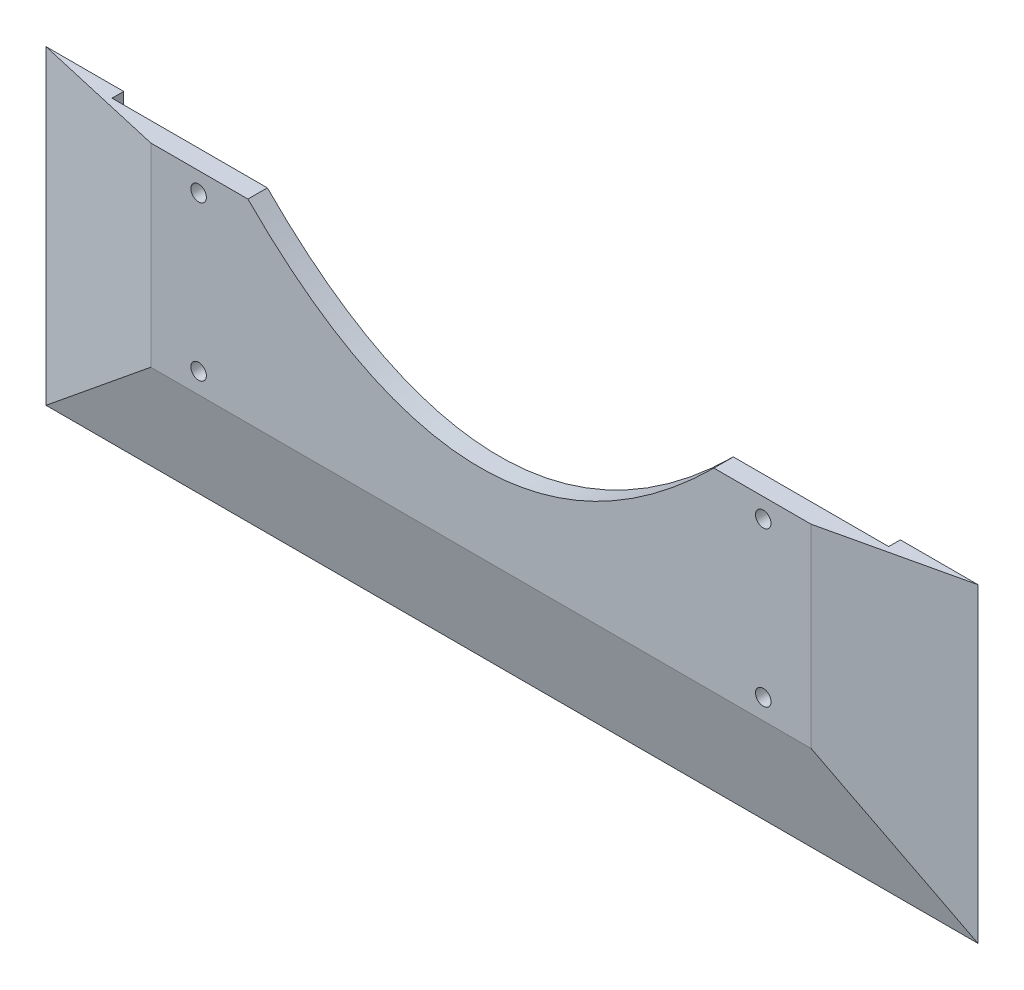
ISO-10303-21;
HEADER;
FILE_DESCRIPTION(('STEP AP214'),'2;1');
FILE_NAME('part.step','',(''),(''),'','','');
FILE_SCHEMA(('AUTOMOTIVE_DESIGN { 1 0 10303 214 1 1 1 1 }'));
ENDSEC;
DATA;
#1=APPLICATION_CONTEXT('core data for automotive mechanical design processes');
#2=APPLICATION_PROTOCOL_DEFINITION('international standard','automotive_design',2000,#1);
#3=PRODUCT_CONTEXT('',#1,'mechanical');
#4=PRODUCT('Part','Part','',(#3));
#5=PRODUCT_RELATED_PRODUCT_CATEGORY('part','',(#4));
#6=PRODUCT_DEFINITION_FORMATION('','',#4);
#7=PRODUCT_DEFINITION_CONTEXT('part definition',#1,'design');
#8=PRODUCT_DEFINITION('design','',#6,#7);
#9=PRODUCT_DEFINITION_SHAPE('','',#8);
#10=(LENGTH_UNIT() NAMED_UNIT(*) SI_UNIT(.MILLI.,.METRE.));
#11=(NAMED_UNIT(*) PLANE_ANGLE_UNIT() SI_UNIT($,.RADIAN.));
#12=(NAMED_UNIT(*) SI_UNIT($,.STERADIAN.) SOLID_ANGLE_UNIT());
#13=UNCERTAINTY_MEASURE_WITH_UNIT(LENGTH_MEASURE(1.E-05),#10,'distance_accuracy_value','');
#14=(GEOMETRIC_REPRESENTATION_CONTEXT(3) GLOBAL_UNCERTAINTY_ASSIGNED_CONTEXT((#13)) GLOBAL_UNIT_ASSIGNED_CONTEXT((#10,
#11,#12)) REPRESENTATION_CONTEXT('',''));
#15=CARTESIAN_POINT('',(0.,0.,0.));
#16=DIRECTION('',(0.,0.,1.));
#17=DIRECTION('',(1.,0.,0.));
#18=AXIS2_PLACEMENT_3D('',#15,#16,#17);
#19=CARTESIAN_POINT('',(60.,35.,8.));
#20=CARTESIAN_POINT('',(-0.461478769127176,-25.0141857673103,8.));
#21=CARTESIAN_POINT('',(-60.,35.,8.));
#22=B_SPLINE_CURVE_WITH_KNOTS('',2,(#19,#20,#21),.UNSPECIFIED.,.F.,.F.,(3,3),(0.,1.),.UNSPECIFIED.);
#23=DIRECTION('',(0.,0.,-1.));
#24=VECTOR('',#23,1.);
#25=SURFACE_OF_LINEAR_EXTRUSION('',#22,#24);
#26=CARTESIAN_POINT('',(-3263.77139057015,1000059.64984074,3.));
#27=CARTESIAN_POINT('',(-7689.95943141798,-999965.442465551,3.));
#28=CARTESIAN_POINT('',(18640.9224169676,999891.213811708,3.));
#29=B_SPLINE_CURVE_WITH_KNOTS('',2,(#26,#27,#28),.UNSPECIFIED.,.F.,.F.,(3,3),(0.,1.),.UNSPECIFIED.);
#30=CARTESIAN_POINT('',(-60.,35.,3.));
#31=VERTEX_POINT('',#30);
#32=CARTESIAN_POINT('',(59.9999999761987,34.9999999764763,3.));
#33=VERTEX_POINT('',#32);
#34=EDGE_CURVE('E119',#31,#33,#29,.T.);
#35=ORIENTED_EDGE('',*,*,#34,.F.);
#36=DIRECTION('',(0.,0.,-1.));
#37=VECTOR('',#36,1.);
#38=CARTESIAN_POINT('',(-60.,35.,8.));
#39=LINE('',#38,#37);
#40=CARTESIAN_POINT('',(-60.,35.,8.));
#41=VERTEX_POINT('',#40);
#42=EDGE_CURVE('E141',#41,#31,#39,.T.);
#43=ORIENTED_EDGE('',*,*,#42,.F.);
#44=CARTESIAN_POINT('',(60.,35.,8.));
#45=VERTEX_POINT('',#44);
#46=EDGE_CURVE('E139',#45,#41,#22,.T.);
#47=ORIENTED_EDGE('',*,*,#46,.F.);
#48=DIRECTION('',(0.,0.,-1.));
#49=VECTOR('',#48,1.);
#50=CARTESIAN_POINT('',(60.,35.,8.));
#51=LINE('',#50,#49);
#52=EDGE_CURVE('E135',#45,#33,#51,.T.);
#53=ORIENTED_EDGE('',*,*,#52,.T.);
#54=EDGE_LOOP('',(#35,#43,#47,#53));
#55=FACE_BOUND('',#54,.T.);
#56=ADVANCED_FACE('F40',(#55),#25,.F.);
#57=CARTESIAN_POINT('',(72.7000000000005,-9.75780257341326,0.));
#58=DIRECTION('',(0.,0.,1.));
#59=DIRECTION('',(1.,0.,0.));
#60=AXIS2_PLACEMENT_3D('',#57,#58,#59);
#61=CYLINDRICAL_SURFACE('',#60,2.);
#62=CARTESIAN_POINT('',(72.7000000000005,-9.75780257341326,8.));
#63=DIRECTION('',(0.,0.,1.));
#64=DIRECTION('',(1.,0.,0.));
#65=AXIS2_PLACEMENT_3D('',#62,#63,#64);
#66=CIRCLE('',#65,2.);
#67=CARTESIAN_POINT('',(74.7000000000005,-9.75780257341326,8.));
#68=VERTEX_POINT('',#67);
#69=EDGE_CURVE('E173',#68,#68,#66,.T.);
#70=ORIENTED_EDGE('',*,*,#69,.T.);
#71=EDGE_LOOP('',(#70));
#72=FACE_BOUND('',#71,.T.);
#73=CARTESIAN_POINT('',(72.7000000000005,-9.75780257341326,3.));
#74=DIRECTION('',(0.,0.,-1.));
#75=DIRECTION('',(-1.,0.,0.));
#76=AXIS2_PLACEMENT_3D('',#73,#74,#75);
#77=CIRCLE('',#76,2.);
#78=CARTESIAN_POINT('',(70.7000000000005,-9.75780257341326,3.));
#79=VERTEX_POINT('',#78);
#80=EDGE_CURVE('E210',#79,#79,#77,.F.);
#81=ORIENTED_EDGE('',*,*,#80,.F.);
#82=EDGE_LOOP('',(#81));
#83=FACE_BOUND('',#82,.T.);
#84=ADVANCED_FACE('F262',(#72,#83),#61,.F.);
#85=CARTESIAN_POINT('',(-72.6999999999995,29.9999999999997,0.));
#86=DIRECTION('',(0.,0.,1.));
#87=DIRECTION('',(1.,0.,0.));
#88=AXIS2_PLACEMENT_3D('',#85,#86,#87);
#89=CYLINDRICAL_SURFACE('',#88,2.);
#90=CARTESIAN_POINT('',(-72.6999999999995,29.9999999999997,8.));
#91=DIRECTION('',(0.,0.,1.));
#92=DIRECTION('',(1.,0.,0.));
#93=AXIS2_PLACEMENT_3D('',#90,#91,#92);
#94=CIRCLE('',#93,2.);
#95=CARTESIAN_POINT('',(-70.6999999999995,29.9999999999997,8.));
#96=VERTEX_POINT('',#95);
#97=EDGE_CURVE('E205',#96,#96,#94,.T.);
#98=ORIENTED_EDGE('',*,*,#97,.T.);
#99=EDGE_LOOP('',(#98));
#100=FACE_BOUND('',#99,.T.);
#101=CARTESIAN_POINT('',(-72.6999999999995,29.9999999999997,3.));
#102=DIRECTION('',(0.,0.,-1.));
#103=DIRECTION('',(-1.,0.,0.));
#104=AXIS2_PLACEMENT_3D('',#101,#102,#103);
#105=CIRCLE('',#104,2.);
#106=CARTESIAN_POINT('',(-74.6999999999995,29.9999999999997,3.));
#107=VERTEX_POINT('',#106);
#108=EDGE_CURVE('E213',#107,#107,#105,.F.);
#109=ORIENTED_EDGE('',*,*,#108,.F.);
#110=EDGE_LOOP('',(#109));
#111=FACE_BOUND('',#110,.T.);
#112=ADVANCED_FACE('F268',(#100,#111),#89,.F.);
#113=CARTESIAN_POINT('',(72.7000000000005,29.9999999999997,0.));
#114=DIRECTION('',(0.,0.,1.));
#115=DIRECTION('',(1.,0.,0.));
#116=AXIS2_PLACEMENT_3D('',#113,#114,#115);
#117=CYLINDRICAL_SURFACE('',#116,2.);
#118=CARTESIAN_POINT('',(72.7000000000005,29.9999999999997,8.));
#119=DIRECTION('',(0.,0.,1.));
#120=DIRECTION('',(1.,0.,0.));
#121=AXIS2_PLACEMENT_3D('',#118,#119,#120);
#122=CIRCLE('',#121,2.);
#123=CARTESIAN_POINT('',(74.7000000000005,29.9999999999997,8.));
#124=VERTEX_POINT('',#123);
#125=EDGE_CURVE('E202',#124,#124,#122,.T.);
#126=ORIENTED_EDGE('',*,*,#125,.T.);
#127=EDGE_LOOP('',(#126));
#128=FACE_BOUND('',#127,.T.);
#129=CARTESIAN_POINT('',(72.7000000000005,29.9999999999997,3.));
#130=DIRECTION('',(0.,0.,-1.));
#131=DIRECTION('',(-1.,0.,0.));
#132=AXIS2_PLACEMENT_3D('',#129,#130,#131);
#133=CIRCLE('',#132,2.);
#134=CARTESIAN_POINT('',(70.7000000000005,29.9999999999997,3.));
#135=VERTEX_POINT('',#134);
#136=EDGE_CURVE('E216',#135,#135,#133,.F.);
#137=ORIENTED_EDGE('',*,*,#136,.F.);
#138=EDGE_LOOP('',(#137));
#139=FACE_BOUND('',#138,.T.);
#140=ADVANCED_FACE('F297',(#128,#139),#117,.F.);
#141=CARTESIAN_POINT('',(-72.6999999999995,-9.75780257341323,0.));
#142=DIRECTION('',(0.,0.,1.));
#143=DIRECTION('',(1.,0.,0.));
#144=AXIS2_PLACEMENT_3D('',#141,#142,#143);
#145=CYLINDRICAL_SURFACE('',#144,2.);
#146=CARTESIAN_POINT('',(-72.6999999999995,-9.75780257341323,8.));
#147=DIRECTION('',(0.,0.,1.));
#148=DIRECTION('',(1.,0.,0.));
#149=AXIS2_PLACEMENT_3D('',#146,#147,#148);
#150=CIRCLE('',#149,2.);
#151=CARTESIAN_POINT('',(-70.6999999999995,-9.75780257341323,8.));
#152=VERTEX_POINT('',#151);
#153=EDGE_CURVE('E178',#152,#152,#150,.T.);
#154=ORIENTED_EDGE('',*,*,#153,.T.);
#155=EDGE_LOOP('',(#154));
#156=FACE_BOUND('',#155,.T.);
#157=CARTESIAN_POINT('',(-72.6999999999995,-9.75780257341323,3.));
#158=DIRECTION('',(0.,0.,-1.));
#159=DIRECTION('',(-1.,0.,0.));
#160=AXIS2_PLACEMENT_3D('',#157,#158,#159);
#161=CIRCLE('',#160,2.);
#162=CARTESIAN_POINT('',(-74.6999999999995,-9.75780257341323,3.));
#163=VERTEX_POINT('',#162);
#164=EDGE_CURVE('E44',#163,#163,#161,.F.);
#165=ORIENTED_EDGE('',*,*,#164,.F.);
#166=EDGE_LOOP('',(#165));
#167=FACE_BOUND('',#166,.T.);
#168=ADVANCED_FACE('F283',(#156,#167),#145,.F.);
#169=CARTESIAN_POINT('',(-100.,35.,8.));
#170=DIRECTION('',(0.,-1.,0.));
#171=DIRECTION('',(1.,0.,0.));
#172=AXIS2_PLACEMENT_3D('',#169,#170,#171);
#173=PLANE('',#172);
#174=DIRECTION('',(-1.,0.,0.));
#175=VECTOR('',#174,1.);
#176=CARTESIAN_POINT('',(-100.,35.,0.));
#177=LINE('',#176,#175);
#178=CARTESIAN_POINT('',(120.,35.,0.));
#179=VERTEX_POINT('',#178);
#180=CARTESIAN_POINT('',(100.,35.,0.));
#181=VERTEX_POINT('',#180);
#182=EDGE_CURVE('E143',#179,#181,#177,.T.);
#183=ORIENTED_EDGE('',*,*,#182,.T.);
#184=DIRECTION('',(0.,0.,-1.));
#185=VECTOR('',#184,1.);
#186=CARTESIAN_POINT('',(100.,35.,3.));
#187=LINE('',#186,#185);
#188=CARTESIAN_POINT('',(100.,35.,3.));
#189=VERTEX_POINT('',#188);
#190=EDGE_CURVE('E136',#189,#181,#187,.T.);
#191=ORIENTED_EDGE('',*,*,#190,.F.);
#192=DIRECTION('',(1.,5.88092595104957E-10,0.));
#193=VECTOR('',#192,1.);
#194=CARTESIAN_POINT('',(59.9999999761987,34.9999999764763,3.));
#195=LINE('',#194,#193);
#196=EDGE_CURVE('E124',#33,#189,#195,.T.);
#197=ORIENTED_EDGE('',*,*,#196,.F.);
#198=ORIENTED_EDGE('',*,*,#52,.F.);
#199=DIRECTION('',(-1.,0.,0.));
#200=VECTOR('',#199,1.);
#201=CARTESIAN_POINT('',(-100.,35.,8.));
#202=LINE('',#201,#200);
#203=CARTESIAN_POINT('',(85.,35.,8.));
#204=VERTEX_POINT('',#203);
#205=EDGE_CURVE('E64',#204,#45,#202,.T.);
#206=ORIENTED_EDGE('',*,*,#205,.F.);
#207=DIRECTION('',(-0.974858506571867,0.,0.222824801502141));
#208=VECTOR('',#207,1.);
#209=CARTESIAN_POINT('',(85.,35.,8.));
#210=LINE('',#209,#208);
#211=EDGE_CURVE('E175',#179,#204,#210,.T.);
#212=ORIENTED_EDGE('',*,*,#211,.F.);
#213=EDGE_LOOP('',(#183,#191,#197,#198,#206,#212));
#214=FACE_BOUND('',#213,.T.);
#215=ADVANCED_FACE('F134',(#214),#173,.F.);
#216=CARTESIAN_POINT('',(0.,0.,8.));
#217=DIRECTION('',(0.,0.,1.));
#218=DIRECTION('',(1.,0.,0.));
#219=AXIS2_PLACEMENT_3D('',#216,#217,#218);
#220=PLANE('',#219);
#221=ORIENTED_EDGE('',*,*,#153,.F.);
#222=EDGE_LOOP('',(#221));
#223=FACE_BOUND('',#222,.T.);
#224=ORIENTED_EDGE('',*,*,#125,.F.);
#225=EDGE_LOOP('',(#224));
#226=FACE_BOUND('',#225,.T.);
#227=ORIENTED_EDGE('',*,*,#97,.F.);
#228=EDGE_LOOP('',(#227));
#229=FACE_BOUND('',#228,.T.);
#230=ORIENTED_EDGE('',*,*,#69,.F.);
#231=EDGE_LOOP('',(#230));
#232=FACE_BOUND('',#231,.T.);
#233=DIRECTION('',(0.,1.,0.));
#234=VECTOR('',#233,1.);
#235=CARTESIAN_POINT('',(85.,-45.,8.));
#236=LINE('',#235,#234);
#237=CARTESIAN_POINT('',(85.,-15.,8.));
#238=VERTEX_POINT('',#237);
#239=EDGE_CURVE('E165',#238,#204,#236,.T.);
#240=ORIENTED_EDGE('',*,*,#239,.T.);
#241=ORIENTED_EDGE('',*,*,#205,.T.);
#242=ORIENTED_EDGE('',*,*,#46,.T.);
#243=CARTESIAN_POINT('',(-85.,35.,8.));
#244=VERTEX_POINT('',#243);
#245=EDGE_CURVE('E152',#41,#244,#202,.T.);
#246=ORIENTED_EDGE('',*,*,#245,.T.);
#247=DIRECTION('',(0.,1.,0.));
#248=VECTOR('',#247,1.);
#249=CARTESIAN_POINT('',(-85.,-45.,8.));
#250=LINE('',#249,#248);
#251=CARTESIAN_POINT('',(-85.,-15.,8.));
#252=VERTEX_POINT('',#251);
#253=EDGE_CURVE('E167',#252,#244,#250,.T.);
#254=ORIENTED_EDGE('',*,*,#253,.F.);
#255=DIRECTION('',(-1.,0.,0.));
#256=VECTOR('',#255,1.);
#257=CARTESIAN_POINT('',(100.,-15.,8.));
#258=LINE('',#257,#256);
#259=EDGE_CURVE('E49',#238,#252,#258,.T.);
#260=ORIENTED_EDGE('',*,*,#259,.F.);
#261=EDGE_LOOP('',(#240,#241,#242,#246,#254,#260));
#262=FACE_BOUND('',#261,.T.);
#263=ADVANCED_FACE('F164',(#223,#226,#229,#232,#262),#220,.T.);
#264=CARTESIAN_POINT('',(0.,0.,0.));
#265=DIRECTION('',(0.,0.,1.));
#266=DIRECTION('',(1.,0.,0.));
#267=AXIS2_PLACEMENT_3D('',#264,#265,#266);
#268=PLANE('',#267);
#269=CARTESIAN_POINT('',(-100.,35.,0.));
#270=VERTEX_POINT('',#269);
#271=CARTESIAN_POINT('',(-120.,35.,0.));
#272=VERTEX_POINT('',#271);
#273=EDGE_CURVE('E140',#270,#272,#177,.T.);
#274=ORIENTED_EDGE('',*,*,#273,.F.);
#275=DIRECTION('',(0.,1.,0.));
#276=VECTOR('',#275,1.);
#277=CARTESIAN_POINT('',(-100.,-25.,0.));
#278=LINE('',#277,#276);
#279=CARTESIAN_POINT('',(-100.,-25.,0.));
#280=VERTEX_POINT('',#279);
#281=EDGE_CURVE('E129',#280,#270,#278,.T.);
#282=ORIENTED_EDGE('',*,*,#281,.F.);
#283=DIRECTION('',(-1.,0.,0.));
#284=VECTOR('',#283,1.);
#285=CARTESIAN_POINT('',(100.,-25.,0.));
#286=LINE('',#285,#284);
#287=CARTESIAN_POINT('',(100.,-25.,0.));
#288=VERTEX_POINT('',#287);
#289=EDGE_CURVE('E227',#288,#280,#286,.T.);
#290=ORIENTED_EDGE('',*,*,#289,.F.);
#291=DIRECTION('',(0.,-1.,0.));
#292=VECTOR('',#291,1.);
#293=CARTESIAN_POINT('',(100.,35.,0.));
#294=LINE('',#293,#292);
#295=EDGE_CURVE('E230',#181,#288,#294,.T.);
#296=ORIENTED_EDGE('',*,*,#295,.F.);
#297=ORIENTED_EDGE('',*,*,#182,.F.);
#298=DIRECTION('',(0.,1.,0.));
#299=VECTOR('',#298,1.);
#300=CARTESIAN_POINT('',(120.,-45.,0.));
#301=LINE('',#300,#299);
#302=CARTESIAN_POINT('',(120.,-45.,0.));
#303=VERTEX_POINT('',#302);
#304=EDGE_CURVE('E185',#303,#179,#301,.T.);
#305=ORIENTED_EDGE('',*,*,#304,.F.);
#306=DIRECTION('',(1.,0.,0.));
#307=VECTOR('',#306,1.);
#308=CARTESIAN_POINT('',(-100.,-45.,0.));
#309=LINE('',#308,#307);
#310=CARTESIAN_POINT('',(-120.,-45.,0.));
#311=VERTEX_POINT('',#310);
#312=EDGE_CURVE('E11',#311,#303,#309,.T.);
#313=ORIENTED_EDGE('',*,*,#312,.F.);
#314=DIRECTION('',(0.,-1.,0.));
#315=VECTOR('',#314,1.);
#316=CARTESIAN_POINT('',(-120.,35.,0.));
#317=LINE('',#316,#315);
#318=EDGE_CURVE('E186',#272,#311,#317,.T.);
#319=ORIENTED_EDGE('',*,*,#318,.F.);
#320=EDGE_LOOP('',(#274,#282,#290,#296,#297,#305,#313,#319));
#321=FACE_BOUND('',#320,.T.);
#322=ADVANCED_FACE('F42',(#321),#268,.F.);
#323=CARTESIAN_POINT('',(100.,-45.,0.));
#324=DIRECTION('',(0.,0.257662650560332,-0.966234939601246));
#325=DIRECTION('',(0.,0.966234939601246,0.257662650560332));
#326=AXIS2_PLACEMENT_3D('',#323,#324,#325);
#327=PLANE('',#326);
#328=ORIENTED_EDGE('',*,*,#312,.T.);
#329=DIRECTION('',(-0.74807503843789,0.641207175803906,0.170988580214375));
#330=VECTOR('',#329,1.);
#331=CARTESIAN_POINT('',(108.807674737323,-35.4065783462768,2.55824577432617));
#332=LINE('',#331,#330);
#333=EDGE_CURVE('E162',#303,#238,#332,.T.);
#334=ORIENTED_EDGE('',*,*,#333,.T.);
#335=ORIENTED_EDGE('',*,*,#259,.T.);
#336=DIRECTION('',(-0.74807503843789,-0.641207175803906,-0.170988580214375));
#337=VECTOR('',#336,1.);
#338=CARTESIAN_POINT('',(3.11557788944727,60.5276381909548,28.1407035175879));
#339=LINE('',#338,#337);
#340=EDGE_CURVE('E160',#252,#311,#339,.T.);
#341=ORIENTED_EDGE('',*,*,#340,.T.);
#342=EDGE_LOOP('',(#328,#334,#335,#341));
#343=FACE_BOUND('',#342,.T.);
#344=ADVANCED_FACE('F159',(#343),#327,.F.);
#345=DIRECTION('',(1.,0.,0.));
#346=VECTOR('',#345,1.);
#347=CARTESIAN_POINT('',(-100.,35.,3.));
#348=LINE('',#347,#346);
#349=CARTESIAN_POINT('',(-100.,35.,3.));
#350=VERTEX_POINT('',#349);
#351=EDGE_CURVE('E56',#350,#31,#348,.T.);
#352=ORIENTED_EDGE('',*,*,#351,.F.);
#353=DIRECTION('',(0.,0.,-1.));
#354=VECTOR('',#353,1.);
#355=CARTESIAN_POINT('',(-100.,35.,3.));
#356=LINE('',#355,#354);
#357=EDGE_CURVE('E224',#350,#270,#356,.T.);
#358=ORIENTED_EDGE('',*,*,#357,.T.);
#359=ORIENTED_EDGE('',*,*,#273,.T.);
#360=DIRECTION('',(-0.974858506571867,0.,-0.222824801502141));
#361=VECTOR('',#360,1.);
#362=CARTESIAN_POINT('',(-85.,35.,8.));
#363=LINE('',#362,#361);
#364=EDGE_CURVE('E172',#244,#272,#363,.T.);
#365=ORIENTED_EDGE('',*,*,#364,.F.);
#366=ORIENTED_EDGE('',*,*,#245,.F.);
#367=ORIENTED_EDGE('',*,*,#42,.T.);
#368=EDGE_LOOP('',(#352,#358,#359,#365,#366,#367));
#369=FACE_BOUND('',#368,.T.);
#370=ADVANCED_FACE('F189',(#369),#173,.F.);
#371=CARTESIAN_POINT('',(85.,-45.,8.));
#372=DIRECTION('',(-0.222824801502141,0.,-0.974858506571867));
#373=DIRECTION('',(-0.974858506571867,0.,0.222824801502141));
#374=AXIS2_PLACEMENT_3D('',#371,#372,#373);
#375=PLANE('',#374);
#376=ORIENTED_EDGE('',*,*,#304,.T.);
#377=ORIENTED_EDGE('',*,*,#211,.T.);
#378=ORIENTED_EDGE('',*,*,#239,.F.);
#379=ORIENTED_EDGE('',*,*,#333,.F.);
#380=EDGE_LOOP('',(#376,#377,#378,#379));
#381=FACE_BOUND('',#380,.T.);
#382=ADVANCED_FACE('F200',(#381),#375,.F.);
#383=CARTESIAN_POINT('',(-85.,-45.,8.));
#384=DIRECTION('',(0.222824801502141,0.,-0.974858506571867));
#385=DIRECTION('',(-0.974858506571867,0.,-0.222824801502141));
#386=AXIS2_PLACEMENT_3D('',#383,#384,#385);
#387=PLANE('',#386);
#388=ORIENTED_EDGE('',*,*,#253,.T.);
#389=ORIENTED_EDGE('',*,*,#364,.T.);
#390=ORIENTED_EDGE('',*,*,#318,.T.);
#391=ORIENTED_EDGE('',*,*,#340,.F.);
#392=EDGE_LOOP('',(#388,#389,#390,#391));
#393=FACE_BOUND('',#392,.T.);
#394=ADVANCED_FACE('F192',(#393),#387,.F.);
#395=CARTESIAN_POINT('',(-0.691959109627049,4.99468033731887,3.));
#396=DIRECTION('',(0.,0.,-1.));
#397=DIRECTION('',(-1.,0.,0.));
#398=AXIS2_PLACEMENT_3D('',#395,#396,#397);
#399=PLANE('',#398);
#400=ORIENTED_EDGE('',*,*,#34,.T.);
#401=ORIENTED_EDGE('',*,*,#196,.T.);
#402=DIRECTION('',(0.,-1.,0.));
#403=VECTOR('',#402,1.);
#404=CARTESIAN_POINT('',(100.,35.,3.));
#405=LINE('',#404,#403);
#406=CARTESIAN_POINT('',(100.,-25.,3.));
#407=VERTEX_POINT('',#406);
#408=EDGE_CURVE('E137',#189,#407,#405,.T.);
#409=ORIENTED_EDGE('',*,*,#408,.T.);
#410=DIRECTION('',(-1.,0.,0.));
#411=VECTOR('',#410,1.);
#412=CARTESIAN_POINT('',(100.,-25.,3.));
#413=LINE('',#412,#411);
#414=CARTESIAN_POINT('',(-100.,-25.,3.));
#415=VERTEX_POINT('',#414);
#416=EDGE_CURVE('E236',#407,#415,#413,.T.);
#417=ORIENTED_EDGE('',*,*,#416,.T.);
#418=DIRECTION('',(0.,1.,0.));
#419=VECTOR('',#418,1.);
#420=CARTESIAN_POINT('',(-100.,-25.,3.));
#421=LINE('',#420,#419);
#422=EDGE_CURVE('E234',#415,#350,#421,.T.);
#423=ORIENTED_EDGE('',*,*,#422,.T.);
#424=ORIENTED_EDGE('',*,*,#351,.T.);
#425=EDGE_LOOP('',(#400,#401,#409,#417,#423,#424));
#426=FACE_BOUND('',#425,.T.);
#427=ORIENTED_EDGE('',*,*,#164,.T.);
#428=EDGE_LOOP('',(#427));
#429=FACE_BOUND('',#428,.T.);
#430=ORIENTED_EDGE('',*,*,#136,.T.);
#431=EDGE_LOOP('',(#430));
#432=FACE_BOUND('',#431,.T.);
#433=ORIENTED_EDGE('',*,*,#108,.T.);
#434=EDGE_LOOP('',(#433));
#435=FACE_BOUND('',#434,.T.);
#436=ORIENTED_EDGE('',*,*,#80,.T.);
#437=EDGE_LOOP('',(#436));
#438=FACE_BOUND('',#437,.T.);
#439=ADVANCED_FACE('F121',(#426,#429,#432,#435,#438),#399,.T.);
#440=CARTESIAN_POINT('',(-100.,-25.,3.));
#441=DIRECTION('',(-1.,0.,0.));
#442=DIRECTION('',(0.,-1.,0.));
#443=AXIS2_PLACEMENT_3D('',#440,#441,#442);
#444=PLANE('',#443);
#445=ORIENTED_EDGE('',*,*,#281,.T.);
#446=ORIENTED_EDGE('',*,*,#357,.F.);
#447=ORIENTED_EDGE('',*,*,#422,.F.);
#448=DIRECTION('',(0.,0.,-1.));
#449=VECTOR('',#448,1.);
#450=CARTESIAN_POINT('',(-100.,-25.,3.));
#451=LINE('',#450,#449);
#452=EDGE_CURVE('E222',#415,#280,#451,.T.);
#453=ORIENTED_EDGE('',*,*,#452,.T.);
#454=EDGE_LOOP('',(#445,#446,#447,#453));
#455=FACE_BOUND('',#454,.T.);
#456=ADVANCED_FACE('F252',(#455),#444,.F.);
#457=CARTESIAN_POINT('',(100.,-25.,3.));
#458=DIRECTION('',(0.,-1.,0.));
#459=DIRECTION('',(0.,0.,-1.));
#460=AXIS2_PLACEMENT_3D('',#457,#458,#459);
#461=PLANE('',#460);
#462=ORIENTED_EDGE('',*,*,#289,.T.);
#463=ORIENTED_EDGE('',*,*,#452,.F.);
#464=ORIENTED_EDGE('',*,*,#416,.F.);
#465=DIRECTION('',(0.,0.,-1.));
#466=VECTOR('',#465,1.);
#467=CARTESIAN_POINT('',(100.,-25.,3.));
#468=LINE('',#467,#466);
#469=EDGE_CURVE('E220',#407,#288,#468,.T.);
#470=ORIENTED_EDGE('',*,*,#469,.T.);
#471=EDGE_LOOP('',(#462,#463,#464,#470));
#472=FACE_BOUND('',#471,.T.);
#473=ADVANCED_FACE('F249',(#472),#461,.F.);
#474=CARTESIAN_POINT('',(100.,35.,3.));
#475=DIRECTION('',(1.,0.,0.));
#476=DIRECTION('',(0.,1.,0.));
#477=AXIS2_PLACEMENT_3D('',#474,#475,#476);
#478=PLANE('',#477);
#479=ORIENTED_EDGE('',*,*,#295,.T.);
#480=ORIENTED_EDGE('',*,*,#469,.F.);
#481=ORIENTED_EDGE('',*,*,#408,.F.);
#482=ORIENTED_EDGE('',*,*,#190,.T.);
#483=EDGE_LOOP('',(#479,#480,#481,#482));
#484=FACE_BOUND('',#483,.T.);
#485=ADVANCED_FACE('F246',(#484),#478,.F.);
#486=CLOSED_SHELL('',(#56,#84,#112,#140,#168,#215,#263,#322,#344,#370,#382,#394,#439,#456,#473,#485));
#487=MANIFOLD_SOLID_BREP('B2',#486);
#488=ADVANCED_BREP_SHAPE_REPRESENTATION('',(#18,#487),#14);
#489=SHAPE_DEFINITION_REPRESENTATION(#9,#488);
ENDSEC;
END-ISO-10303-21;
